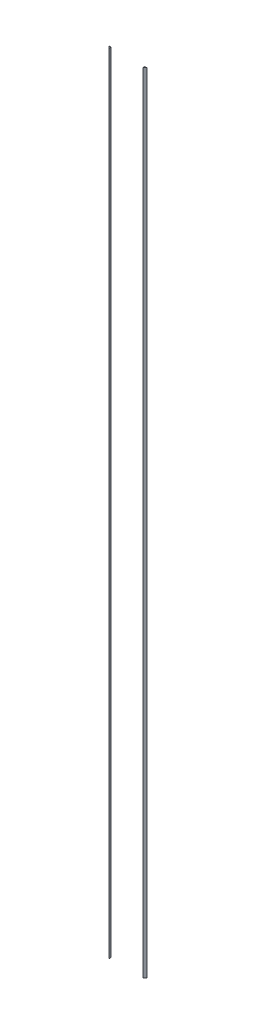
ISO-10303-21;
HEADER;
FILE_DESCRIPTION(('STEP AP214'),'2;1');
FILE_NAME('part.step','',(''),(''),'','','');
FILE_SCHEMA(('AUTOMOTIVE_DESIGN { 1 0 10303 214 1 1 1 1 }'));
ENDSEC;
DATA;
#1=APPLICATION_CONTEXT('core data for automotive mechanical design processes');
#2=APPLICATION_PROTOCOL_DEFINITION('international standard','automotive_design',2000,#1);
#3=PRODUCT_CONTEXT('',#1,'mechanical');
#4=PRODUCT('Part','Part','',(#3));
#5=PRODUCT_RELATED_PRODUCT_CATEGORY('part','',(#4));
#6=PRODUCT_DEFINITION_FORMATION('','',#4);
#7=PRODUCT_DEFINITION_CONTEXT('part definition',#1,'design');
#8=PRODUCT_DEFINITION('design','',#6,#7);
#9=PRODUCT_DEFINITION_SHAPE('','',#8);
#10=(LENGTH_UNIT() NAMED_UNIT(*) SI_UNIT(.MILLI.,.METRE.));
#11=(NAMED_UNIT(*) PLANE_ANGLE_UNIT() SI_UNIT($,.RADIAN.));
#12=(NAMED_UNIT(*) SI_UNIT($,.STERADIAN.) SOLID_ANGLE_UNIT());
#13=UNCERTAINTY_MEASURE_WITH_UNIT(LENGTH_MEASURE(1.E-05),#10,'distance_accuracy_value','');
#14=(GEOMETRIC_REPRESENTATION_CONTEXT(3) GLOBAL_UNCERTAINTY_ASSIGNED_CONTEXT((#13)) GLOBAL_UNIT_ASSIGNED_CONTEXT((#10,
#11,#12)) REPRESENTATION_CONTEXT('',''));
#15=CARTESIAN_POINT('',(0.,0.,0.));
#16=DIRECTION('',(0.,0.,1.));
#17=DIRECTION('',(1.,0.,0.));
#18=AXIS2_PLACEMENT_3D('',#15,#16,#17);
#19=CARTESIAN_POINT('',(25.,1000.,3.00000000000006));
#20=DIRECTION('',(-1.,0.,0.));
#21=DIRECTION('',(0.,0.,1.));
#22=AXIS2_PLACEMENT_3D('',#19,#20,#21);
#23=PLANE('',#22);
#24=DIRECTION('',(0.,0.,-1.));
#25=VECTOR('',#24,1.);
#26=CARTESIAN_POINT('',(25.,-175.,3.00000000000006));
#27=LINE('',#26,#25);
#28=CARTESIAN_POINT('',(25.,-175.,3.00000000000006));
#29=VERTEX_POINT('',#28);
#30=CARTESIAN_POINT('',(25.,-175.,0.));
#31=VERTEX_POINT('',#30);
#32=EDGE_CURVE('E12',#29,#31,#27,.T.);
#33=ORIENTED_EDGE('',*,*,#32,.F.);
#34=DIRECTION('',(0.,-1.,0.));
#35=VECTOR('',#34,1.);
#36=CARTESIAN_POINT('',(25.,1000.,3.00000000000006));
#37=LINE('',#36,#35);
#38=CARTESIAN_POINT('',(25.,1000.,3.00000000000006));
#39=VERTEX_POINT('',#38);
#40=EDGE_CURVE('E87',#39,#29,#37,.T.);
#41=ORIENTED_EDGE('',*,*,#40,.F.);
#42=DIRECTION('',(0.,0.,-1.));
#43=VECTOR('',#42,1.);
#44=CARTESIAN_POINT('',(25.,1000.,3.00000000000006));
#45=LINE('',#44,#43);
#46=CARTESIAN_POINT('',(25.,1000.,0.));
#47=VERTEX_POINT('',#46);
#48=EDGE_CURVE('E53',#39,#47,#45,.T.);
#49=ORIENTED_EDGE('',*,*,#48,.T.);
#50=DIRECTION('',(0.,-1.,0.));
#51=VECTOR('',#50,1.);
#52=CARTESIAN_POINT('',(25.,1000.,0.));
#53=LINE('',#52,#51);
#54=EDGE_CURVE('E68',#47,#31,#53,.T.);
#55=ORIENTED_EDGE('',*,*,#54,.T.);
#56=EDGE_LOOP('',(#33,#41,#49,#55));
#57=FACE_BOUND('',#56,.T.);
#58=ADVANCED_FACE('F49',(#57),#23,.T.);
#59=CARTESIAN_POINT('',(25.,1000.,3.00000000000006));
#60=DIRECTION('',(0.707106781186552,0.,0.707106781186543));
#61=DIRECTION('',(0.707106781186543,0.,-0.707106781186552));
#62=AXIS2_PLACEMENT_3D('',#59,#60,#61);
#63=PLANE('',#62);
#64=DIRECTION('',(-0.707106781186543,0.,0.707106781186552));
#65=VECTOR('',#64,1.);
#66=CARTESIAN_POINT('',(25.,-175.,3.00000000000006));
#67=LINE('',#66,#65);
#68=CARTESIAN_POINT('',(28.,-175.,0.));
#69=VERTEX_POINT('',#68);
#70=EDGE_CURVE('E90',#69,#29,#67,.T.);
#71=ORIENTED_EDGE('',*,*,#70,.F.);
#72=DIRECTION('',(0.,-1.,0.));
#73=VECTOR('',#72,1.);
#74=CARTESIAN_POINT('',(28.,1000.,0.));
#75=LINE('',#74,#73);
#76=CARTESIAN_POINT('',(28.,1000.,0.));
#77=VERTEX_POINT('',#76);
#78=EDGE_CURVE('E82',#77,#69,#75,.T.);
#79=ORIENTED_EDGE('',*,*,#78,.F.);
#80=DIRECTION('',(-0.707106781186543,0.,0.707106781186552));
#81=VECTOR('',#80,1.);
#82=CARTESIAN_POINT('',(25.,1000.,3.00000000000006));
#83=LINE('',#82,#81);
#84=EDGE_CURVE('E92',#77,#39,#83,.T.);
#85=ORIENTED_EDGE('',*,*,#84,.T.);
#86=ORIENTED_EDGE('',*,*,#40,.T.);
#87=EDGE_LOOP('',(#71,#79,#85,#86));
#88=FACE_BOUND('',#87,.T.);
#89=ADVANCED_FACE('F88',(#88),#63,.T.);
#90=CARTESIAN_POINT('',(25.,1000.,0.));
#91=DIRECTION('',(0.,0.,-1.));
#92=DIRECTION('',(-1.,0.,0.));
#93=AXIS2_PLACEMENT_3D('',#90,#91,#92);
#94=PLANE('',#93);
#95=DIRECTION('',(1.,0.,0.));
#96=VECTOR('',#95,1.);
#97=CARTESIAN_POINT('',(25.,-175.,0.));
#98=LINE('',#97,#96);
#99=EDGE_CURVE('E59',#31,#69,#98,.T.);
#100=ORIENTED_EDGE('',*,*,#99,.F.);
#101=ORIENTED_EDGE('',*,*,#54,.F.);
#102=DIRECTION('',(1.,0.,0.));
#103=VECTOR('',#102,1.);
#104=CARTESIAN_POINT('',(25.,1000.,0.));
#105=LINE('',#104,#103);
#106=EDGE_CURVE('E100',#47,#77,#105,.T.);
#107=ORIENTED_EDGE('',*,*,#106,.T.);
#108=ORIENTED_EDGE('',*,*,#78,.T.);
#109=EDGE_LOOP('',(#100,#101,#107,#108));
#110=FACE_BOUND('',#109,.T.);
#111=ADVANCED_FACE('F103',(#110),#94,.T.);
#112=CARTESIAN_POINT('',(0.,1000.,0.));
#113=DIRECTION('',(0.,-1.,0.));
#114=DIRECTION('',(0.,0.,-1.));
#115=AXIS2_PLACEMENT_3D('',#112,#113,#114);
#116=PLANE('',#115);
#117=ORIENTED_EDGE('',*,*,#48,.F.);
#118=ORIENTED_EDGE('',*,*,#84,.F.);
#119=ORIENTED_EDGE('',*,*,#106,.F.);
#120=EDGE_LOOP('',(#117,#118,#119));
#121=FACE_BOUND('',#120,.T.);
#122=ADVANCED_FACE('F51',(#121),#116,.F.);
#123=CARTESIAN_POINT('',(0.,-175.,0.));
#124=DIRECTION('',(0.,-1.,0.));
#125=DIRECTION('',(0.,0.,-1.));
#126=AXIS2_PLACEMENT_3D('',#123,#124,#125);
#127=PLANE('',#126);
#128=ORIENTED_EDGE('',*,*,#32,.T.);
#129=ORIENTED_EDGE('',*,*,#99,.T.);
#130=ORIENTED_EDGE('',*,*,#70,.T.);
#131=EDGE_LOOP('',(#128,#129,#130));
#132=FACE_BOUND('',#131,.T.);
#133=ADVANCED_FACE('F97',(#132),#127,.T.);
#134=CLOSED_SHELL('',(#58,#89,#111,#122,#133));
#135=MANIFOLD_SOLID_BREP('B2',#134);
#136=CARTESIAN_POINT('',(-25.,1000.,3.));
#137=DIRECTION('',(-0.707106781186554,0.,0.707106781186541));
#138=DIRECTION('',(0.707106781186541,0.,0.707106781186554));
#139=AXIS2_PLACEMENT_3D('',#136,#137,#138);
#140=PLANE('',#139);
#141=DIRECTION('',(-0.707106781186541,0.,-0.707106781186554));
#142=VECTOR('',#141,1.);
#143=CARTESIAN_POINT('',(-25.,-175.,3.));
#144=LINE('',#143,#142);
#145=CARTESIAN_POINT('',(-25.,-175.,3.));
#146=VERTEX_POINT('',#145);
#147=CARTESIAN_POINT('',(-28.,-175.,0.));
#148=VERTEX_POINT('',#147);
#149=EDGE_CURVE('E199',#146,#148,#144,.T.);
#150=ORIENTED_EDGE('',*,*,#149,.F.);
#151=DIRECTION('',(0.,-1.,0.));
#152=VECTOR('',#151,1.);
#153=CARTESIAN_POINT('',(-25.,1000.,3.));
#154=LINE('',#153,#152);
#155=CARTESIAN_POINT('',(-25.,1000.,3.));
#156=VERTEX_POINT('',#155);
#157=EDGE_CURVE('E47',#156,#146,#154,.T.);
#158=ORIENTED_EDGE('',*,*,#157,.F.);
#159=DIRECTION('',(-0.707106781186541,0.,-0.707106781186554));
#160=VECTOR('',#159,1.);
#161=CARTESIAN_POINT('',(-25.,1000.,3.));
#162=LINE('',#161,#160);
#163=CARTESIAN_POINT('',(-28.,1000.,0.));
#164=VERTEX_POINT('',#163);
#165=EDGE_CURVE('E191',#156,#164,#162,.T.);
#166=ORIENTED_EDGE('',*,*,#165,.T.);
#167=DIRECTION('',(0.,-1.,0.));
#168=VECTOR('',#167,1.);
#169=CARTESIAN_POINT('',(-28.,1000.,0.));
#170=LINE('',#169,#168);
#171=EDGE_CURVE('E150',#164,#148,#170,.T.);
#172=ORIENTED_EDGE('',*,*,#171,.T.);
#173=EDGE_LOOP('',(#150,#158,#166,#172));
#174=FACE_BOUND('',#173,.T.);
#175=ADVANCED_FACE('F147',(#174),#140,.T.);
#176=CARTESIAN_POINT('',(-25.,1000.,3.));
#177=DIRECTION('',(1.,0.,0.));
#178=DIRECTION('',(0.,0.,-1.));
#179=AXIS2_PLACEMENT_3D('',#176,#177,#178);
#180=PLANE('',#179);
#181=DIRECTION('',(0.,0.,1.));
#182=VECTOR('',#181,1.);
#183=CARTESIAN_POINT('',(-25.,-175.,3.));
#184=LINE('',#183,#182);
#185=CARTESIAN_POINT('',(-25.,-175.,0.));
#186=VERTEX_POINT('',#185);
#187=EDGE_CURVE('E193',#186,#146,#184,.T.);
#188=ORIENTED_EDGE('',*,*,#187,.F.);
#189=DIRECTION('',(0.,-1.,0.));
#190=VECTOR('',#189,1.);
#191=CARTESIAN_POINT('',(-25.,1000.,0.));
#192=LINE('',#191,#190);
#193=CARTESIAN_POINT('',(-25.,1000.,0.));
#194=VERTEX_POINT('',#193);
#195=EDGE_CURVE('E156',#194,#186,#192,.T.);
#196=ORIENTED_EDGE('',*,*,#195,.F.);
#197=DIRECTION('',(0.,0.,1.));
#198=VECTOR('',#197,1.);
#199=CARTESIAN_POINT('',(-25.,1000.,3.));
#200=LINE('',#199,#198);
#201=EDGE_CURVE('E188',#194,#156,#200,.T.);
#202=ORIENTED_EDGE('',*,*,#201,.T.);
#203=ORIENTED_EDGE('',*,*,#157,.T.);
#204=EDGE_LOOP('',(#188,#196,#202,#203));
#205=FACE_BOUND('',#204,.T.);
#206=ADVANCED_FACE('F203',(#205),#180,.T.);
#207=CARTESIAN_POINT('',(-25.,1000.,0.));
#208=DIRECTION('',(0.,0.,-1.));
#209=DIRECTION('',(-1.,0.,0.));
#210=AXIS2_PLACEMENT_3D('',#207,#208,#209);
#211=PLANE('',#210);
#212=DIRECTION('',(1.,0.,0.));
#213=VECTOR('',#212,1.);
#214=CARTESIAN_POINT('',(-25.,-175.,0.));
#215=LINE('',#214,#213);
#216=EDGE_CURVE('E186',#148,#186,#215,.T.);
#217=ORIENTED_EDGE('',*,*,#216,.F.);
#218=ORIENTED_EDGE('',*,*,#171,.F.);
#219=DIRECTION('',(1.,0.,0.));
#220=VECTOR('',#219,1.);
#221=CARTESIAN_POINT('',(-25.,1000.,0.));
#222=LINE('',#221,#220);
#223=EDGE_CURVE('E184',#164,#194,#222,.T.);
#224=ORIENTED_EDGE('',*,*,#223,.T.);
#225=ORIENTED_EDGE('',*,*,#195,.T.);
#226=EDGE_LOOP('',(#217,#218,#224,#225));
#227=FACE_BOUND('',#226,.T.);
#228=ADVANCED_FACE('F183',(#227),#211,.T.);
#229=CARTESIAN_POINT('',(0.,1000.,0.));
#230=DIRECTION('',(0.,1.,0.));
#231=DIRECTION('',(0.,0.,1.));
#232=AXIS2_PLACEMENT_3D('',#229,#230,#231);
#233=PLANE('',#232);
#234=ORIENTED_EDGE('',*,*,#165,.F.);
#235=ORIENTED_EDGE('',*,*,#201,.F.);
#236=ORIENTED_EDGE('',*,*,#223,.F.);
#237=EDGE_LOOP('',(#234,#235,#236));
#238=FACE_BOUND('',#237,.T.);
#239=ADVANCED_FACE('F190',(#238),#233,.T.);
#240=CARTESIAN_POINT('',(0.,-175.,0.));
#241=DIRECTION('',(0.,1.,0.));
#242=DIRECTION('',(0.,0.,1.));
#243=AXIS2_PLACEMENT_3D('',#240,#241,#242);
#244=PLANE('',#243);
#245=ORIENTED_EDGE('',*,*,#149,.T.);
#246=ORIENTED_EDGE('',*,*,#216,.T.);
#247=ORIENTED_EDGE('',*,*,#187,.T.);
#248=EDGE_LOOP('',(#245,#246,#247));
#249=FACE_BOUND('',#248,.T.);
#250=ADVANCED_FACE('F202',(#249),#244,.F.);
#251=CLOSED_SHELL('',(#175,#206,#228,#239,#250));
#252=MANIFOLD_SOLID_BREP('B6',#251);
#253=ADVANCED_BREP_SHAPE_REPRESENTATION('',(#18,#135,#252),#14);
#254=SHAPE_DEFINITION_REPRESENTATION(#9,#253);
ENDSEC;
END-ISO-10303-21;
